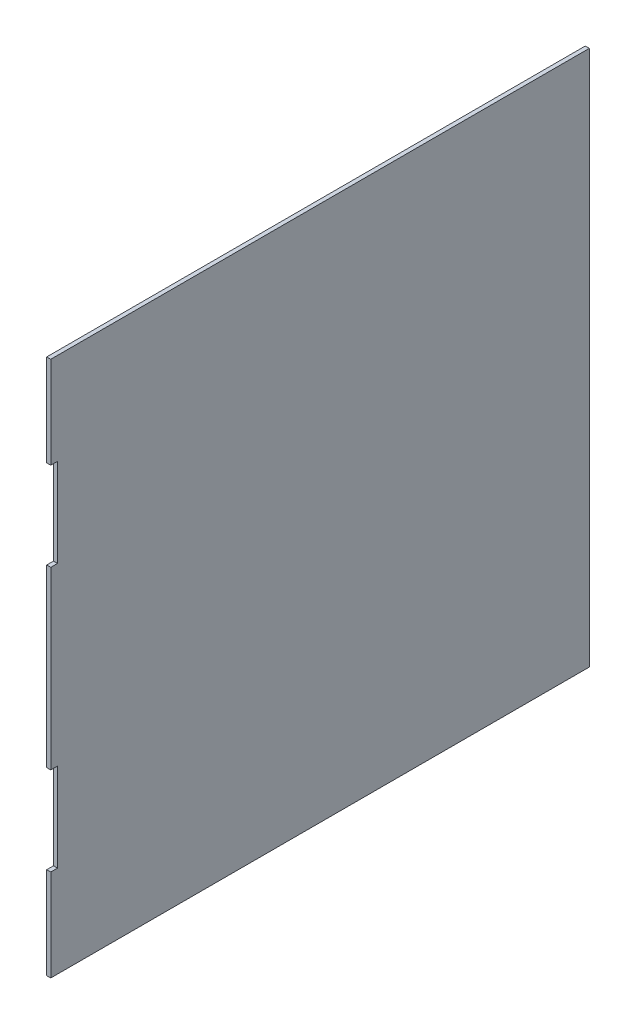
ISO-10303-21;
HEADER;
FILE_DESCRIPTION(('STEP AP214'),'2;1');
FILE_NAME('part.step','',(''),(''),'','','');
FILE_SCHEMA(('AUTOMOTIVE_DESIGN { 1 0 10303 214 1 1 1 1 }'));
ENDSEC;
DATA;
#1=APPLICATION_CONTEXT('core data for automotive mechanical design processes');
#2=APPLICATION_PROTOCOL_DEFINITION('international standard','automotive_design',2000,#1);
#3=PRODUCT_CONTEXT('',#1,'mechanical');
#4=PRODUCT('Part','Part','',(#3));
#5=PRODUCT_RELATED_PRODUCT_CATEGORY('part','',(#4));
#6=PRODUCT_DEFINITION_FORMATION('','',#4);
#7=PRODUCT_DEFINITION_CONTEXT('part definition',#1,'design');
#8=PRODUCT_DEFINITION('design','',#6,#7);
#9=PRODUCT_DEFINITION_SHAPE('','',#8);
#10=(LENGTH_UNIT() NAMED_UNIT(*) SI_UNIT(.MILLI.,.METRE.));
#11=(NAMED_UNIT(*) PLANE_ANGLE_UNIT() SI_UNIT($,.RADIAN.));
#12=(NAMED_UNIT(*) SI_UNIT($,.STERADIAN.) SOLID_ANGLE_UNIT());
#13=UNCERTAINTY_MEASURE_WITH_UNIT(LENGTH_MEASURE(1.E-05),#10,'distance_accuracy_value','');
#14=(GEOMETRIC_REPRESENTATION_CONTEXT(3) GLOBAL_UNCERTAINTY_ASSIGNED_CONTEXT((#13)) GLOBAL_UNIT_ASSIGNED_CONTEXT((#10,
#11,#12)) REPRESENTATION_CONTEXT('',''));
#15=CARTESIAN_POINT('',(0.,0.,0.));
#16=DIRECTION('',(0.,0.,1.));
#17=DIRECTION('',(1.,0.,0.));
#18=AXIS2_PLACEMENT_3D('',#15,#16,#17);
#19=CARTESIAN_POINT('',(3.,-198.5,199.5));
#20=DIRECTION('',(0.,0.,-1.));
#21=DIRECTION('',(-1.,0.,0.));
#22=AXIS2_PLACEMENT_3D('',#19,#20,#21);
#23=PLANE('',#22);
#24=DIRECTION('',(0.,-1.,0.));
#25=VECTOR('',#24,1.);
#26=CARTESIAN_POINT('',(0.,-198.5,199.5));
#27=LINE('',#26,#25);
#28=CARTESIAN_POINT('',(0.,198.5,199.5));
#29=VERTEX_POINT('',#28);
#30=CARTESIAN_POINT('',(0.,130.5,199.5));
#31=VERTEX_POINT('',#30);
#32=EDGE_CURVE('E154',#29,#31,#27,.T.);
#33=ORIENTED_EDGE('',*,*,#32,.T.);
#34=DIRECTION('',(1.,0.,0.));
#35=VECTOR('',#34,1.);
#36=CARTESIAN_POINT('',(0.,130.5,199.5));
#37=LINE('',#36,#35);
#38=CARTESIAN_POINT('',(3.,130.5,199.5));
#39=VERTEX_POINT('',#38);
#40=EDGE_CURVE('E204',#31,#39,#37,.T.);
#41=ORIENTED_EDGE('',*,*,#40,.T.);
#42=DIRECTION('',(0.,-1.,0.));
#43=VECTOR('',#42,1.);
#44=CARTESIAN_POINT('',(3.,-198.5,199.5));
#45=LINE('',#44,#43);
#46=CARTESIAN_POINT('',(3.,198.5,199.5));
#47=VERTEX_POINT('',#46);
#48=EDGE_CURVE('E184',#47,#39,#45,.T.);
#49=ORIENTED_EDGE('',*,*,#48,.F.);
#50=DIRECTION('',(-1.,0.,0.));
#51=VECTOR('',#50,1.);
#52=CARTESIAN_POINT('',(3.,198.5,199.5));
#53=LINE('',#52,#51);
#54=EDGE_CURVE('E47',#47,#29,#53,.T.);
#55=ORIENTED_EDGE('',*,*,#54,.T.);
#56=EDGE_LOOP('',(#33,#41,#49,#55));
#57=FACE_BOUND('',#56,.T.);
#58=ADVANCED_FACE('F38',(#57),#23,.F.);
#59=CARTESIAN_POINT('',(3.,-130.5,199.5));
#60=VERTEX_POINT('',#59);
#61=CARTESIAN_POINT('',(3.,-198.5,199.5));
#62=VERTEX_POINT('',#61);
#63=EDGE_CURVE('E250',#60,#62,#45,.T.);
#64=ORIENTED_EDGE('',*,*,#63,.F.);
#65=DIRECTION('',(1.,0.,0.));
#66=VECTOR('',#65,1.);
#67=CARTESIAN_POINT('',(0.,-130.5,199.5));
#68=LINE('',#67,#66);
#69=CARTESIAN_POINT('',(0.,-130.5,199.5));
#70=VERTEX_POINT('',#69);
#71=EDGE_CURVE('E198',#70,#60,#68,.T.);
#72=ORIENTED_EDGE('',*,*,#71,.F.);
#73=CARTESIAN_POINT('',(0.,-198.5,199.5));
#74=VERTEX_POINT('',#73);
#75=EDGE_CURVE('E155',#70,#74,#27,.T.);
#76=ORIENTED_EDGE('',*,*,#75,.T.);
#77=DIRECTION('',(-1.,0.,0.));
#78=VECTOR('',#77,1.);
#79=CARTESIAN_POINT('',(3.,-198.5,199.5));
#80=LINE('',#79,#78);
#81=EDGE_CURVE('E172',#62,#74,#80,.T.);
#82=ORIENTED_EDGE('',*,*,#81,.F.);
#83=EDGE_LOOP('',(#64,#72,#76,#82));
#84=FACE_BOUND('',#83,.T.);
#85=ADVANCED_FACE('F274',(#84),#23,.F.);
#86=CARTESIAN_POINT('',(3.,-198.5,-199.5));
#87=DIRECTION('',(0.,0.,1.));
#88=DIRECTION('',(1.,0.,0.));
#89=AXIS2_PLACEMENT_3D('',#86,#87,#88);
#90=PLANE('',#89);
#91=DIRECTION('',(0.,1.,0.));
#92=VECTOR('',#91,1.);
#93=CARTESIAN_POINT('',(0.,-198.5,-199.5));
#94=LINE('',#93,#92);
#95=CARTESIAN_POINT('',(0.,-198.5,-199.5));
#96=VERTEX_POINT('',#95);
#97=CARTESIAN_POINT('',(0.,198.5,-199.5));
#98=VERTEX_POINT('',#97);
#99=EDGE_CURVE('E207',#96,#98,#94,.T.);
#100=ORIENTED_EDGE('',*,*,#99,.T.);
#101=DIRECTION('',(-1.,0.,0.));
#102=VECTOR('',#101,1.);
#103=CARTESIAN_POINT('',(3.,198.5,-199.5));
#104=LINE('',#103,#102);
#105=CARTESIAN_POINT('',(3.,198.5,-199.5));
#106=VERTEX_POINT('',#105);
#107=EDGE_CURVE('E11',#106,#98,#104,.T.);
#108=ORIENTED_EDGE('',*,*,#107,.F.);
#109=DIRECTION('',(0.,1.,0.));
#110=VECTOR('',#109,1.);
#111=CARTESIAN_POINT('',(3.,-198.5,-199.5));
#112=LINE('',#111,#110);
#113=CARTESIAN_POINT('',(3.,-198.5,-199.5));
#114=VERTEX_POINT('',#113);
#115=EDGE_CURVE('E167',#114,#106,#112,.T.);
#116=ORIENTED_EDGE('',*,*,#115,.F.);
#117=DIRECTION('',(-1.,0.,0.));
#118=VECTOR('',#117,1.);
#119=CARTESIAN_POINT('',(3.,-198.5,-199.5));
#120=LINE('',#119,#118);
#121=EDGE_CURVE('E168',#114,#96,#120,.T.);
#122=ORIENTED_EDGE('',*,*,#121,.T.);
#123=EDGE_LOOP('',(#100,#108,#116,#122));
#124=FACE_BOUND('',#123,.T.);
#125=ADVANCED_FACE('F40',(#124),#90,.F.);
#126=CARTESIAN_POINT('',(3.,198.5,199.5));
#127=DIRECTION('',(0.,-1.,0.));
#128=DIRECTION('',(0.,0.,-1.));
#129=AXIS2_PLACEMENT_3D('',#126,#127,#128);
#130=PLANE('',#129);
#131=DIRECTION('',(0.,0.,1.));
#132=VECTOR('',#131,1.);
#133=CARTESIAN_POINT('',(0.,198.5,199.5));
#134=LINE('',#133,#132);
#135=EDGE_CURVE('E161',#98,#29,#134,.T.);
#136=ORIENTED_EDGE('',*,*,#135,.T.);
#137=ORIENTED_EDGE('',*,*,#54,.F.);
#138=DIRECTION('',(0.,0.,1.));
#139=VECTOR('',#138,1.);
#140=CARTESIAN_POINT('',(3.,198.5,199.5));
#141=LINE('',#140,#139);
#142=EDGE_CURVE('E247',#106,#47,#141,.T.);
#143=ORIENTED_EDGE('',*,*,#142,.F.);
#144=ORIENTED_EDGE('',*,*,#107,.T.);
#145=EDGE_LOOP('',(#136,#137,#143,#144));
#146=FACE_BOUND('',#145,.T.);
#147=ADVANCED_FACE('F259',(#146),#130,.F.);
#148=CARTESIAN_POINT('',(3.,65.,199.5));
#149=VERTEX_POINT('',#148);
#150=CARTESIAN_POINT('',(3.,-65.,199.5));
#151=VERTEX_POINT('',#150);
#152=EDGE_CURVE('E146',#149,#151,#45,.T.);
#153=ORIENTED_EDGE('',*,*,#152,.F.);
#154=DIRECTION('',(1.,0.,0.));
#155=VECTOR('',#154,1.);
#156=CARTESIAN_POINT('',(0.,65.,199.5));
#157=LINE('',#156,#155);
#158=CARTESIAN_POINT('',(0.,65.,199.5));
#159=VERTEX_POINT('',#158);
#160=EDGE_CURVE('E131',#159,#149,#157,.T.);
#161=ORIENTED_EDGE('',*,*,#160,.F.);
#162=CARTESIAN_POINT('',(0.,-65.,199.5));
#163=VERTEX_POINT('',#162);
#164=EDGE_CURVE('E144',#159,#163,#27,.T.);
#165=ORIENTED_EDGE('',*,*,#164,.T.);
#166=DIRECTION('',(1.,0.,0.));
#167=VECTOR('',#166,1.);
#168=CARTESIAN_POINT('',(0.,-65.,199.5));
#169=LINE('',#168,#167);
#170=EDGE_CURVE('E236',#163,#151,#169,.T.);
#171=ORIENTED_EDGE('',*,*,#170,.T.);
#172=EDGE_LOOP('',(#153,#161,#165,#171));
#173=FACE_BOUND('',#172,.T.);
#174=ADVANCED_FACE('F142',(#173),#23,.F.);
#175=CARTESIAN_POINT('',(3.,-198.5,199.5));
#176=DIRECTION('',(0.,1.,0.));
#177=DIRECTION('',(0.,0.,1.));
#178=AXIS2_PLACEMENT_3D('',#175,#176,#177);
#179=PLANE('',#178);
#180=DIRECTION('',(0.,0.,-1.));
#181=VECTOR('',#180,1.);
#182=CARTESIAN_POINT('',(0.,-198.5,199.5));
#183=LINE('',#182,#181);
#184=EDGE_CURVE('E160',#74,#96,#183,.T.);
#185=ORIENTED_EDGE('',*,*,#184,.T.);
#186=ORIENTED_EDGE('',*,*,#121,.F.);
#187=DIRECTION('',(0.,0.,-1.));
#188=VECTOR('',#187,1.);
#189=CARTESIAN_POINT('',(3.,-198.5,199.5));
#190=LINE('',#189,#188);
#191=EDGE_CURVE('E173',#62,#114,#190,.T.);
#192=ORIENTED_EDGE('',*,*,#191,.F.);
#193=ORIENTED_EDGE('',*,*,#81,.T.);
#194=EDGE_LOOP('',(#185,#186,#192,#193));
#195=FACE_BOUND('',#194,.T.);
#196=ADVANCED_FACE('F269',(#195),#179,.F.);
#197=CARTESIAN_POINT('',(3.,0.,0.));
#198=DIRECTION('',(-1.,0.,0.));
#199=DIRECTION('',(0.,0.,1.));
#200=AXIS2_PLACEMENT_3D('',#197,#198,#199);
#201=PLANE('',#200);
#202=ORIENTED_EDGE('',*,*,#48,.T.);
#203=DIRECTION('',(0.,0.,1.));
#204=VECTOR('',#203,1.);
#205=CARTESIAN_POINT('',(3.,130.5,199.5));
#206=LINE('',#205,#204);
#207=CARTESIAN_POINT('',(3.,130.5,194.5));
#208=VERTEX_POINT('',#207);
#209=EDGE_CURVE('E137',#208,#39,#206,.T.);
#210=ORIENTED_EDGE('',*,*,#209,.F.);
#211=DIRECTION('',(0.,1.,0.));
#212=VECTOR('',#211,1.);
#213=CARTESIAN_POINT('',(3.,130.5,194.5));
#214=LINE('',#213,#212);
#215=CARTESIAN_POINT('',(3.,65.,194.5));
#216=VERTEX_POINT('',#215);
#217=EDGE_CURVE('E197',#216,#208,#214,.T.);
#218=ORIENTED_EDGE('',*,*,#217,.F.);
#219=DIRECTION('',(0.,0.,-1.));
#220=VECTOR('',#219,1.);
#221=CARTESIAN_POINT('',(3.,65.,199.5));
#222=LINE('',#221,#220);
#223=EDGE_CURVE('E194',#149,#216,#222,.T.);
#224=ORIENTED_EDGE('',*,*,#223,.F.);
#225=ORIENTED_EDGE('',*,*,#152,.T.);
#226=DIRECTION('',(0.,0.,1.));
#227=VECTOR('',#226,1.);
#228=CARTESIAN_POINT('',(3.,-65.,199.5));
#229=LINE('',#228,#227);
#230=CARTESIAN_POINT('',(3.,-65.,194.5));
#231=VERTEX_POINT('',#230);
#232=EDGE_CURVE('E218',#231,#151,#229,.T.);
#233=ORIENTED_EDGE('',*,*,#232,.F.);
#234=DIRECTION('',(0.,1.,0.));
#235=VECTOR('',#234,1.);
#236=CARTESIAN_POINT('',(3.,-130.5,194.5));
#237=LINE('',#236,#235);
#238=CARTESIAN_POINT('',(3.,-130.5,194.5));
#239=VERTEX_POINT('',#238);
#240=EDGE_CURVE('E228',#239,#231,#237,.T.);
#241=ORIENTED_EDGE('',*,*,#240,.F.);
#242=DIRECTION('',(0.,0.,-1.));
#243=VECTOR('',#242,1.);
#244=CARTESIAN_POINT('',(3.,-130.5,199.5));
#245=LINE('',#244,#243);
#246=EDGE_CURVE('E224',#60,#239,#245,.T.);
#247=ORIENTED_EDGE('',*,*,#246,.F.);
#248=ORIENTED_EDGE('',*,*,#63,.T.);
#249=ORIENTED_EDGE('',*,*,#191,.T.);
#250=ORIENTED_EDGE('',*,*,#115,.T.);
#251=ORIENTED_EDGE('',*,*,#142,.T.);
#252=EDGE_LOOP('',(#202,#210,#218,#224,#225,#233,#241,#247,#248,#249,#250,#251));
#253=FACE_BOUND('',#252,.T.);
#254=ADVANCED_FACE('F263',(#253),#201,.F.);
#255=CARTESIAN_POINT('',(0.,0.,0.));
#256=DIRECTION('',(-1.,0.,0.));
#257=DIRECTION('',(0.,0.,1.));
#258=AXIS2_PLACEMENT_3D('',#255,#256,#257);
#259=PLANE('',#258);
#260=DIRECTION('',(0.,0.,1.));
#261=VECTOR('',#260,1.);
#262=CARTESIAN_POINT('',(0.,130.5,199.5));
#263=LINE('',#262,#261);
#264=CARTESIAN_POINT('',(0.,130.5,194.5));
#265=VERTEX_POINT('',#264);
#266=EDGE_CURVE('E148',#265,#31,#263,.T.);
#267=ORIENTED_EDGE('',*,*,#266,.T.);
#268=ORIENTED_EDGE('',*,*,#32,.F.);
#269=ORIENTED_EDGE('',*,*,#135,.F.);
#270=ORIENTED_EDGE('',*,*,#99,.F.);
#271=ORIENTED_EDGE('',*,*,#184,.F.);
#272=ORIENTED_EDGE('',*,*,#75,.F.);
#273=DIRECTION('',(0.,0.,-1.));
#274=VECTOR('',#273,1.);
#275=CARTESIAN_POINT('',(0.,-130.5,199.5));
#276=LINE('',#275,#274);
#277=CARTESIAN_POINT('',(0.,-130.5,194.5));
#278=VERTEX_POINT('',#277);
#279=EDGE_CURVE('E213',#70,#278,#276,.T.);
#280=ORIENTED_EDGE('',*,*,#279,.T.);
#281=DIRECTION('',(0.,1.,0.));
#282=VECTOR('',#281,1.);
#283=CARTESIAN_POINT('',(0.,-130.5,194.5));
#284=LINE('',#283,#282);
#285=CARTESIAN_POINT('',(0.,-65.,194.5));
#286=VERTEX_POINT('',#285);
#287=EDGE_CURVE('E217',#278,#286,#284,.T.);
#288=ORIENTED_EDGE('',*,*,#287,.T.);
#289=DIRECTION('',(0.,0.,1.));
#290=VECTOR('',#289,1.);
#291=CARTESIAN_POINT('',(0.,-65.,199.5));
#292=LINE('',#291,#290);
#293=EDGE_CURVE('E62',#286,#163,#292,.T.);
#294=ORIENTED_EDGE('',*,*,#293,.T.);
#295=ORIENTED_EDGE('',*,*,#164,.F.);
#296=DIRECTION('',(0.,0.,-1.));
#297=VECTOR('',#296,1.);
#298=CARTESIAN_POINT('',(0.,65.,199.5));
#299=LINE('',#298,#297);
#300=CARTESIAN_POINT('',(0.,65.,194.5));
#301=VERTEX_POINT('',#300);
#302=EDGE_CURVE('E127',#159,#301,#299,.T.);
#303=ORIENTED_EDGE('',*,*,#302,.T.);
#304=DIRECTION('',(0.,1.,0.));
#305=VECTOR('',#304,1.);
#306=CARTESIAN_POINT('',(0.,130.5,194.5));
#307=LINE('',#306,#305);
#308=EDGE_CURVE('E54',#301,#265,#307,.T.);
#309=ORIENTED_EDGE('',*,*,#308,.T.);
#310=EDGE_LOOP('',(#267,#268,#269,#270,#271,#272,#280,#288,#294,#295,#303,#309));
#311=FACE_BOUND('',#310,.T.);
#312=ADVANCED_FACE('F151',(#311),#259,.T.);
#313=CARTESIAN_POINT('',(0.,-130.5,199.5));
#314=DIRECTION('',(0.,-1.,0.));
#315=DIRECTION('',(0.,0.,-1.));
#316=AXIS2_PLACEMENT_3D('',#313,#314,#315);
#317=PLANE('',#316);
#318=ORIENTED_EDGE('',*,*,#246,.T.);
#319=DIRECTION('',(1.,0.,0.));
#320=VECTOR('',#319,1.);
#321=CARTESIAN_POINT('',(0.,-130.5,194.5));
#322=LINE('',#321,#320);
#323=EDGE_CURVE('E223',#278,#239,#322,.T.);
#324=ORIENTED_EDGE('',*,*,#323,.F.);
#325=ORIENTED_EDGE('',*,*,#279,.F.);
#326=ORIENTED_EDGE('',*,*,#71,.T.);
#327=EDGE_LOOP('',(#318,#324,#325,#326));
#328=FACE_BOUND('',#327,.T.);
#329=ADVANCED_FACE('F276',(#328),#317,.F.);
#330=CARTESIAN_POINT('',(0.,-65.,199.5));
#331=DIRECTION('',(0.,1.,0.));
#332=DIRECTION('',(0.,0.,1.));
#333=AXIS2_PLACEMENT_3D('',#330,#331,#332);
#334=PLANE('',#333);
#335=ORIENTED_EDGE('',*,*,#232,.T.);
#336=ORIENTED_EDGE('',*,*,#170,.F.);
#337=ORIENTED_EDGE('',*,*,#293,.F.);
#338=DIRECTION('',(1.,0.,0.));
#339=VECTOR('',#338,1.);
#340=CARTESIAN_POINT('',(0.,-65.,194.5));
#341=LINE('',#340,#339);
#342=EDGE_CURVE('E239',#286,#231,#341,.T.);
#343=ORIENTED_EDGE('',*,*,#342,.T.);
#344=EDGE_LOOP('',(#335,#336,#337,#343));
#345=FACE_BOUND('',#344,.T.);
#346=ADVANCED_FACE('F282',(#345),#334,.F.);
#347=CARTESIAN_POINT('',(0.,-130.5,194.5));
#348=DIRECTION('',(0.,0.,-1.));
#349=DIRECTION('',(0.,1.,0.));
#350=AXIS2_PLACEMENT_3D('',#347,#348,#349);
#351=PLANE('',#350);
#352=ORIENTED_EDGE('',*,*,#240,.T.);
#353=ORIENTED_EDGE('',*,*,#342,.F.);
#354=ORIENTED_EDGE('',*,*,#287,.F.);
#355=ORIENTED_EDGE('',*,*,#323,.T.);
#356=EDGE_LOOP('',(#352,#353,#354,#355));
#357=FACE_BOUND('',#356,.T.);
#358=ADVANCED_FACE('F280',(#357),#351,.F.);
#359=CARTESIAN_POINT('',(0.,130.5,199.5));
#360=DIRECTION('',(0.,1.,0.));
#361=DIRECTION('',(0.,0.,1.));
#362=AXIS2_PLACEMENT_3D('',#359,#360,#361);
#363=PLANE('',#362);
#364=ORIENTED_EDGE('',*,*,#209,.T.);
#365=ORIENTED_EDGE('',*,*,#40,.F.);
#366=ORIENTED_EDGE('',*,*,#266,.F.);
#367=DIRECTION('',(1.,0.,0.));
#368=VECTOR('',#367,1.);
#369=CARTESIAN_POINT('',(0.,130.5,194.5));
#370=LINE('',#369,#368);
#371=EDGE_CURVE('E208',#265,#208,#370,.T.);
#372=ORIENTED_EDGE('',*,*,#371,.T.);
#373=EDGE_LOOP('',(#364,#365,#366,#372));
#374=FACE_BOUND('',#373,.T.);
#375=ADVANCED_FACE('F288',(#374),#363,.F.);
#376=CARTESIAN_POINT('',(0.,130.5,194.5));
#377=DIRECTION('',(0.,0.,-1.));
#378=DIRECTION('',(0.,1.,0.));
#379=AXIS2_PLACEMENT_3D('',#376,#377,#378);
#380=PLANE('',#379);
#381=ORIENTED_EDGE('',*,*,#217,.T.);
#382=ORIENTED_EDGE('',*,*,#371,.F.);
#383=ORIENTED_EDGE('',*,*,#308,.F.);
#384=DIRECTION('',(1.,0.,0.));
#385=VECTOR('',#384,1.);
#386=CARTESIAN_POINT('',(0.,65.,194.5));
#387=LINE('',#386,#385);
#388=EDGE_CURVE('E133',#301,#216,#387,.T.);
#389=ORIENTED_EDGE('',*,*,#388,.T.);
#390=EDGE_LOOP('',(#381,#382,#383,#389));
#391=FACE_BOUND('',#390,.T.);
#392=ADVANCED_FACE('F287',(#391),#380,.F.);
#393=CARTESIAN_POINT('',(0.,65.,199.5));
#394=DIRECTION('',(0.,-1.,0.));
#395=DIRECTION('',(0.,0.,-1.));
#396=AXIS2_PLACEMENT_3D('',#393,#394,#395);
#397=PLANE('',#396);
#398=ORIENTED_EDGE('',*,*,#223,.T.);
#399=ORIENTED_EDGE('',*,*,#388,.F.);
#400=ORIENTED_EDGE('',*,*,#302,.F.);
#401=ORIENTED_EDGE('',*,*,#160,.T.);
#402=EDGE_LOOP('',(#398,#399,#400,#401));
#403=FACE_BOUND('',#402,.T.);
#404=ADVANCED_FACE('F130',(#403),#397,.F.);
#405=CLOSED_SHELL('',(#58,#85,#125,#147,#174,#196,#254,#312,#329,#346,#358,#375,#392,#404));
#406=MANIFOLD_SOLID_BREP('B2',#405);
#407=ADVANCED_BREP_SHAPE_REPRESENTATION('',(#18,#406),#14);
#408=SHAPE_DEFINITION_REPRESENTATION(#9,#407);
ENDSEC;
END-ISO-10303-21;
